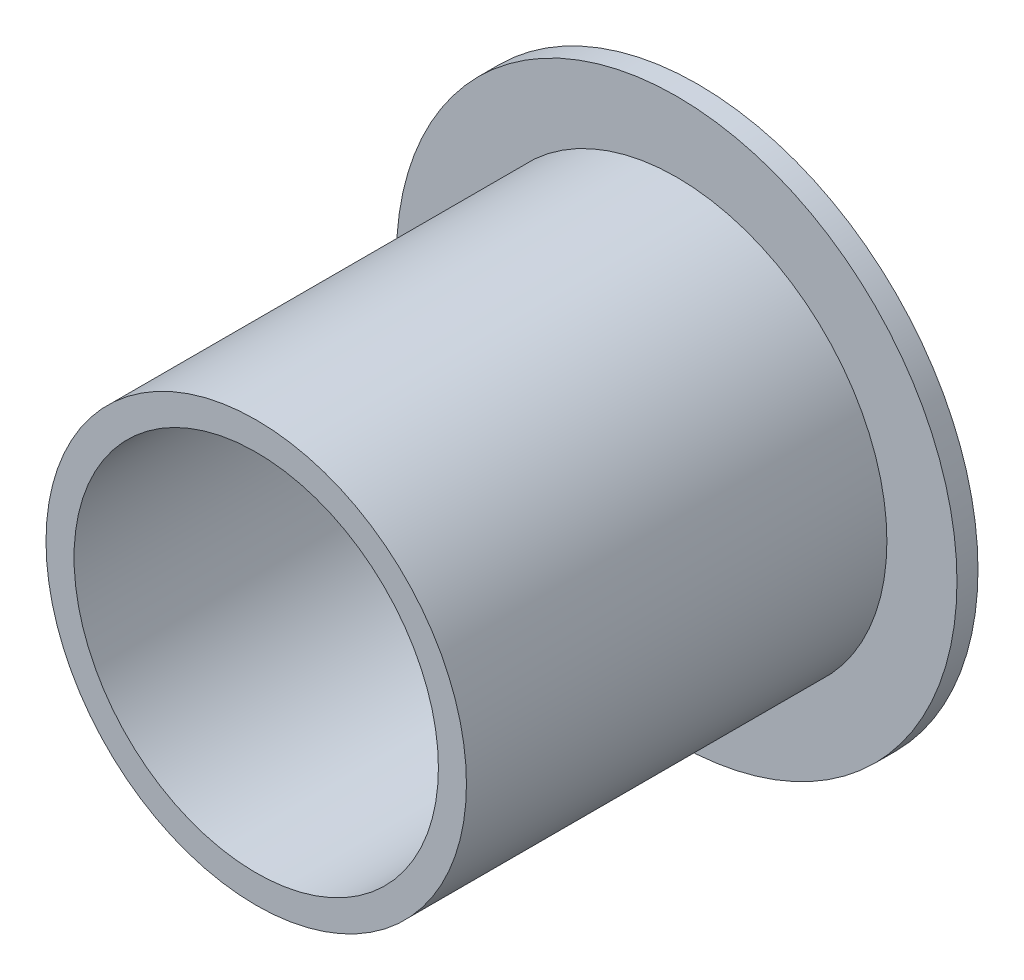
ISO-10303-21;
HEADER;
FILE_DESCRIPTION(('STEP AP214'),'2;1');
FILE_NAME('part.step','',(''),(''),'','','');
FILE_SCHEMA(('AUTOMOTIVE_DESIGN { 1 0 10303 214 1 1 1 1 }'));
ENDSEC;
DATA;
#1=APPLICATION_CONTEXT('core data for automotive mechanical design processes');
#2=APPLICATION_PROTOCOL_DEFINITION('international standard','automotive_design',2000,#1);
#3=PRODUCT_CONTEXT('',#1,'mechanical');
#4=PRODUCT('Part','Part','',(#3));
#5=PRODUCT_RELATED_PRODUCT_CATEGORY('part','',(#4));
#6=PRODUCT_DEFINITION_FORMATION('','',#4);
#7=PRODUCT_DEFINITION_CONTEXT('part definition',#1,'design');
#8=PRODUCT_DEFINITION('design','',#6,#7);
#9=PRODUCT_DEFINITION_SHAPE('','',#8);
#10=(LENGTH_UNIT() NAMED_UNIT(*) SI_UNIT(.MILLI.,.METRE.));
#11=(NAMED_UNIT(*) PLANE_ANGLE_UNIT() SI_UNIT($,.RADIAN.));
#12=(NAMED_UNIT(*) SI_UNIT($,.STERADIAN.) SOLID_ANGLE_UNIT());
#13=UNCERTAINTY_MEASURE_WITH_UNIT(LENGTH_MEASURE(1.E-05),#10,'distance_accuracy_value','');
#14=(GEOMETRIC_REPRESENTATION_CONTEXT(3) GLOBAL_UNCERTAINTY_ASSIGNED_CONTEXT((#13)) GLOBAL_UNIT_ASSIGNED_CONTEXT((#10,
#11,#12)) REPRESENTATION_CONTEXT('',''));
#15=CARTESIAN_POINT('',(0.,0.,0.));
#16=DIRECTION('',(0.,0.,1.));
#17=DIRECTION('',(1.,0.,0.));
#18=AXIS2_PLACEMENT_3D('',#15,#16,#17);
#19=CARTESIAN_POINT('',(0.,0.,1.5));
#20=DIRECTION('',(0.,0.,-1.));
#21=DIRECTION('',(-1.,0.,0.));
#22=AXIS2_PLACEMENT_3D('',#19,#20,#21);
#23=CYLINDRICAL_SURFACE('',#22,20.);
#24=CARTESIAN_POINT('',(0.,0.,1.5));
#25=DIRECTION('',(0.,0.,1.));
#26=DIRECTION('',(1.,0.,0.));
#27=AXIS2_PLACEMENT_3D('',#24,#25,#26);
#28=CIRCLE('',#27,20.);
#29=CARTESIAN_POINT('',(20.,0.,1.5));
#30=VERTEX_POINT('',#29);
#31=EDGE_CURVE('E39',#30,#30,#28,.T.);
#32=ORIENTED_EDGE('',*,*,#31,.F.);
#33=EDGE_LOOP('',(#32));
#34=FACE_BOUND('',#33,.T.);
#35=CARTESIAN_POINT('',(0.,0.,0.));
#36=DIRECTION('',(0.,0.,1.));
#37=DIRECTION('',(1.,0.,0.));
#38=AXIS2_PLACEMENT_3D('',#35,#36,#37);
#39=CIRCLE('',#38,20.);
#40=CARTESIAN_POINT('',(20.,0.,0.));
#41=VERTEX_POINT('',#40);
#42=EDGE_CURVE('E43',#41,#41,#39,.T.);
#43=ORIENTED_EDGE('',*,*,#42,.T.);
#44=EDGE_LOOP('',(#43));
#45=FACE_BOUND('',#44,.T.);
#46=ADVANCED_FACE('F32',(#34,#45),#23,.T.);
#47=CARTESIAN_POINT('',(0.,0.,1.5));
#48=DIRECTION('',(0.,0.,1.));
#49=DIRECTION('',(1.,0.,0.));
#50=AXIS2_PLACEMENT_3D('',#47,#48,#49);
#51=PLANE('',#50);
#52=CARTESIAN_POINT('',(0.,0.,1.5));
#53=DIRECTION('',(0.,0.,1.));
#54=DIRECTION('',(1.,0.,0.));
#55=AXIS2_PLACEMENT_3D('',#52,#53,#54);
#56=CIRCLE('',#55,15.);
#57=CARTESIAN_POINT('',(15.,0.,1.5));
#58=VERTEX_POINT('',#57);
#59=EDGE_CURVE('E49',#58,#58,#56,.T.);
#60=ORIENTED_EDGE('',*,*,#59,.F.);
#61=EDGE_LOOP('',(#60));
#62=FACE_BOUND('',#61,.T.);
#63=ORIENTED_EDGE('',*,*,#31,.T.);
#64=EDGE_LOOP('',(#63));
#65=FACE_BOUND('',#64,.T.);
#66=ADVANCED_FACE('F71',(#62,#65),#51,.T.);
#67=CARTESIAN_POINT('',(0.,0.,0.));
#68=DIRECTION('',(0.,0.,1.));
#69=DIRECTION('',(1.,0.,0.));
#70=AXIS2_PLACEMENT_3D('',#67,#68,#69);
#71=PLANE('',#70);
#72=CARTESIAN_POINT('',(0.,0.,0.));
#73=DIRECTION('',(0.,0.,-1.));
#74=DIRECTION('',(-1.,0.,0.));
#75=AXIS2_PLACEMENT_3D('',#72,#73,#74);
#76=CIRCLE('',#75,10.);
#77=CARTESIAN_POINT('',(-10.,0.,0.));
#78=VERTEX_POINT('',#77);
#79=EDGE_CURVE('E57',#78,#78,#76,.T.);
#80=ORIENTED_EDGE('',*,*,#79,.F.);
#81=EDGE_LOOP('',(#80));
#82=FACE_BOUND('',#81,.T.);
#83=ORIENTED_EDGE('',*,*,#42,.F.);
#84=EDGE_LOOP('',(#83));
#85=FACE_BOUND('',#84,.T.);
#86=ADVANCED_FACE('F82',(#82,#85),#71,.F.);
#87=CARTESIAN_POINT('',(0.,0.,31.5));
#88=DIRECTION('',(0.,0.,1.));
#89=DIRECTION('',(1.,0.,0.));
#90=AXIS2_PLACEMENT_3D('',#87,#88,#89);
#91=PLANE('',#90);
#92=CARTESIAN_POINT('',(0.,0.,31.5));
#93=DIRECTION('',(0.,0.,1.));
#94=DIRECTION('',(1.,0.,0.));
#95=AXIS2_PLACEMENT_3D('',#92,#93,#94);
#96=CIRCLE('',#95,15.);
#97=CARTESIAN_POINT('',(15.,0.,31.5));
#98=VERTEX_POINT('',#97);
#99=EDGE_CURVE('E47',#98,#98,#96,.T.);
#100=ORIENTED_EDGE('',*,*,#99,.T.);
#101=EDGE_LOOP('',(#100));
#102=FACE_BOUND('',#101,.T.);
#103=CARTESIAN_POINT('',(0.,0.,31.5));
#104=DIRECTION('',(0.,0.,1.));
#105=DIRECTION('',(1.,0.,0.));
#106=AXIS2_PLACEMENT_3D('',#103,#104,#105);
#107=CIRCLE('',#106,13.);
#108=CARTESIAN_POINT('',(13.,0.,31.5));
#109=VERTEX_POINT('',#108);
#110=EDGE_CURVE('E52',#109,#109,#107,.T.);
#111=ORIENTED_EDGE('',*,*,#110,.F.);
#112=EDGE_LOOP('',(#111));
#113=FACE_BOUND('',#112,.T.);
#114=ADVANCED_FACE('F93',(#102,#113),#91,.T.);
#115=CARTESIAN_POINT('',(0.,0.,31.5));
#116=DIRECTION('',(0.,0.,-1.));
#117=DIRECTION('',(-1.,0.,0.));
#118=AXIS2_PLACEMENT_3D('',#115,#116,#117);
#119=CYLINDRICAL_SURFACE('',#118,15.);
#120=ORIENTED_EDGE('',*,*,#99,.F.);
#121=EDGE_LOOP('',(#120));
#122=FACE_BOUND('',#121,.T.);
#123=ORIENTED_EDGE('',*,*,#59,.T.);
#124=EDGE_LOOP('',(#123));
#125=FACE_BOUND('',#124,.T.);
#126=ADVANCED_FACE('F77',(#122,#125),#119,.T.);
#127=CARTESIAN_POINT('',(0.,0.,31.5));
#128=DIRECTION('',(0.,0.,-1.));
#129=DIRECTION('',(-1.,0.,0.));
#130=AXIS2_PLACEMENT_3D('',#127,#128,#129);
#131=CYLINDRICAL_SURFACE('',#130,13.);
#132=ORIENTED_EDGE('',*,*,#110,.T.);
#133=EDGE_LOOP('',(#132));
#134=FACE_BOUND('',#133,.T.);
#135=CARTESIAN_POINT('',(0.,0.,1.5));
#136=DIRECTION('',(0.,0.,1.));
#137=DIRECTION('',(1.,0.,0.));
#138=AXIS2_PLACEMENT_3D('',#135,#136,#137);
#139=CIRCLE('',#138,13.);
#140=CARTESIAN_POINT('',(13.,0.,1.5));
#141=VERTEX_POINT('',#140);
#142=EDGE_CURVE('E10',#141,#141,#139,.F.);
#143=ORIENTED_EDGE('',*,*,#142,.T.);
#144=EDGE_LOOP('',(#143));
#145=FACE_BOUND('',#144,.T.);
#146=ADVANCED_FACE('F69',(#134,#145),#131,.F.);
#147=CARTESIAN_POINT('',(0.,0.,1.5));
#148=DIRECTION('',(0.,0.,1.));
#149=DIRECTION('',(1.,0.,0.));
#150=AXIS2_PLACEMENT_3D('',#147,#148,#149);
#151=CIRCLE('',#150,10.);
#152=CARTESIAN_POINT('',(10.,0.,1.5));
#153=VERTEX_POINT('',#152);
#154=EDGE_CURVE('E35',#153,#153,#151,.T.);
#155=ORIENTED_EDGE('',*,*,#154,.F.);
#156=EDGE_LOOP('',(#155));
#157=FACE_BOUND('',#156,.T.);
#158=ORIENTED_EDGE('',*,*,#142,.F.);
#159=EDGE_LOOP('',(#158));
#160=FACE_BOUND('',#159,.T.);
#161=ADVANCED_FACE('F66',(#157,#160),#51,.T.);
#162=CARTESIAN_POINT('',(0.,0.,30.));
#163=DIRECTION('',(0.,0.,-1.));
#164=DIRECTION('',(-1.,0.,0.));
#165=AXIS2_PLACEMENT_3D('',#162,#163,#164);
#166=CYLINDRICAL_SURFACE('',#165,10.);
#167=ORIENTED_EDGE('',*,*,#154,.T.);
#168=EDGE_LOOP('',(#167));
#169=FACE_BOUND('',#168,.T.);
#170=ORIENTED_EDGE('',*,*,#79,.T.);
#171=EDGE_LOOP('',(#170));
#172=FACE_BOUND('',#171,.T.);
#173=ADVANCED_FACE('F64',(#169,#172),#166,.F.);
#174=CLOSED_SHELL('',(#46,#66,#86,#114,#126,#146,#161,#173));
#175=MANIFOLD_SOLID_BREP('B2',#174);
#176=ADVANCED_BREP_SHAPE_REPRESENTATION('',(#18,#175),#14);
#177=SHAPE_DEFINITION_REPRESENTATION(#9,#176);
ENDSEC;
END-ISO-10303-21;
